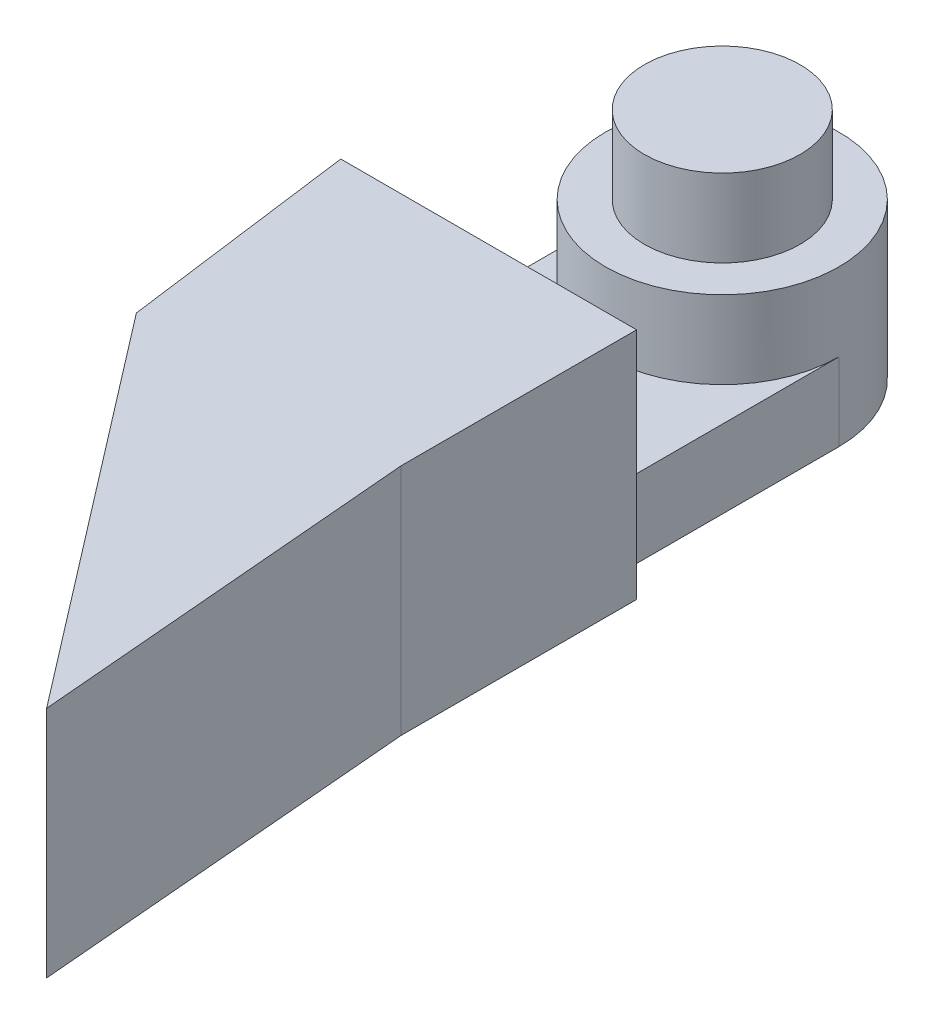
ISO-10303-21;
HEADER;
FILE_DESCRIPTION(('STEP AP214'),'2;1');
FILE_NAME('part.step','',(''),(''),'','','');
FILE_SCHEMA(('AUTOMOTIVE_DESIGN { 1 0 10303 214 1 1 1 1 }'));
ENDSEC;
DATA;
#1=APPLICATION_CONTEXT('core data for automotive mechanical design processes');
#2=APPLICATION_PROTOCOL_DEFINITION('international standard','automotive_design',2000,#1);
#3=PRODUCT_CONTEXT('',#1,'mechanical');
#4=PRODUCT('Part','Part','',(#3));
#5=PRODUCT_RELATED_PRODUCT_CATEGORY('part','',(#4));
#6=PRODUCT_DEFINITION_FORMATION('','',#4);
#7=PRODUCT_DEFINITION_CONTEXT('part definition',#1,'design');
#8=PRODUCT_DEFINITION('design','',#6,#7);
#9=PRODUCT_DEFINITION_SHAPE('','',#8);
#10=(LENGTH_UNIT() NAMED_UNIT(*) SI_UNIT(.MILLI.,.METRE.));
#11=(NAMED_UNIT(*) PLANE_ANGLE_UNIT() SI_UNIT($,.RADIAN.));
#12=(NAMED_UNIT(*) SI_UNIT($,.STERADIAN.) SOLID_ANGLE_UNIT());
#13=UNCERTAINTY_MEASURE_WITH_UNIT(LENGTH_MEASURE(1.E-05),#10,'distance_accuracy_value','');
#14=(GEOMETRIC_REPRESENTATION_CONTEXT(3) GLOBAL_UNCERTAINTY_ASSIGNED_CONTEXT((#13)) GLOBAL_UNIT_ASSIGNED_CONTEXT((#10,
#11,#12)) REPRESENTATION_CONTEXT('',''));
#15=CARTESIAN_POINT('',(0.,0.,0.));
#16=DIRECTION('',(0.,0.,1.));
#17=DIRECTION('',(1.,0.,0.));
#18=AXIS2_PLACEMENT_3D('',#15,#16,#17);
#19=CARTESIAN_POINT('',(0.,10.,0.));
#20=DIRECTION('',(0.,-1.,0.));
#21=DIRECTION('',(0.,0.,-1.));
#22=AXIS2_PLACEMENT_3D('',#19,#20,#21);
#23=CYLINDRICAL_SURFACE('',#22,7.5);
#24=CARTESIAN_POINT('',(0.,10.,0.));
#25=DIRECTION('',(0.,1.,0.));
#26=DIRECTION('',(0.,0.,1.));
#27=AXIS2_PLACEMENT_3D('',#24,#25,#26);
#28=CIRCLE('',#27,7.5);
#29=CARTESIAN_POINT('',(0.,10.,7.5));
#30=VERTEX_POINT('',#29);
#31=EDGE_CURVE('E11',#30,#30,#28,.T.);
#32=ORIENTED_EDGE('',*,*,#31,.F.);
#33=EDGE_LOOP('',(#32));
#34=FACE_BOUND('',#33,.T.);
#35=DIRECTION('',(0.,-1.,0.));
#36=VECTOR('',#35,1.);
#37=CARTESIAN_POINT('',(-7.5,5.,0.));
#38=LINE('',#37,#36);
#39=CARTESIAN_POINT('',(-7.5,5.,0.));
#40=VERTEX_POINT('',#39);
#41=CARTESIAN_POINT('',(-7.5,0.,0.));
#42=VERTEX_POINT('',#41);
#43=EDGE_CURVE('E55',#40,#42,#38,.T.);
#44=ORIENTED_EDGE('',*,*,#43,.F.);
#45=CARTESIAN_POINT('',(0.,5.,0.));
#46=DIRECTION('',(0.,1.,0.));
#47=DIRECTION('',(0.,0.,1.));
#48=AXIS2_PLACEMENT_3D('',#45,#46,#47);
#49=CIRCLE('',#48,7.5);
#50=CARTESIAN_POINT('',(7.5,5.,0.));
#51=VERTEX_POINT('',#50);
#52=EDGE_CURVE('E50',#40,#51,#49,.T.);
#53=ORIENTED_EDGE('',*,*,#52,.T.);
#54=DIRECTION('',(0.,-1.,0.));
#55=VECTOR('',#54,1.);
#56=CARTESIAN_POINT('',(7.5,5.,0.));
#57=LINE('',#56,#55);
#58=CARTESIAN_POINT('',(7.5,0.,0.));
#59=VERTEX_POINT('',#58);
#60=EDGE_CURVE('E149',#51,#59,#57,.T.);
#61=ORIENTED_EDGE('',*,*,#60,.T.);
#62=CARTESIAN_POINT('',(0.,0.,0.));
#63=DIRECTION('',(0.,1.,0.));
#64=DIRECTION('',(0.,0.,1.));
#65=AXIS2_PLACEMENT_3D('',#62,#63,#64);
#66=CIRCLE('',#65,7.5);
#67=EDGE_CURVE('E38',#59,#42,#66,.T.);
#68=ORIENTED_EDGE('',*,*,#67,.T.);
#69=EDGE_LOOP('',(#44,#53,#61,#68));
#70=FACE_BOUND('',#69,.T.);
#71=ADVANCED_FACE('F35',(#34,#70),#23,.T.);
#72=CARTESIAN_POINT('',(0.,10.,0.));
#73=DIRECTION('',(0.,1.,0.));
#74=DIRECTION('',(0.,0.,1.));
#75=AXIS2_PLACEMENT_3D('',#72,#73,#74);
#76=PLANE('',#75);
#77=CARTESIAN_POINT('',(0.,10.,0.));
#78=DIRECTION('',(0.,1.,0.));
#79=DIRECTION('',(0.,0.,1.));
#80=AXIS2_PLACEMENT_3D('',#77,#78,#79);
#81=CIRCLE('',#80,5.);
#82=CARTESIAN_POINT('',(0.,10.,5.));
#83=VERTEX_POINT('',#82);
#84=EDGE_CURVE('E43',#83,#83,#81,.T.);
#85=ORIENTED_EDGE('',*,*,#84,.F.);
#86=EDGE_LOOP('',(#85));
#87=FACE_BOUND('',#86,.T.);
#88=ORIENTED_EDGE('',*,*,#31,.T.);
#89=EDGE_LOOP('',(#88));
#90=FACE_BOUND('',#89,.T.);
#91=ADVANCED_FACE('F218',(#87,#90),#76,.T.);
#92=CARTESIAN_POINT('',(0.,0.,0.));
#93=DIRECTION('',(0.,1.,0.));
#94=DIRECTION('',(0.,0.,1.));
#95=AXIS2_PLACEMENT_3D('',#92,#93,#94);
#96=PLANE('',#95);
#97=ORIENTED_EDGE('',*,*,#67,.F.);
#98=DIRECTION('',(0.,0.,1.));
#99=VECTOR('',#98,1.);
#100=CARTESIAN_POINT('',(7.5,0.,0.));
#101=LINE('',#100,#99);
#102=CARTESIAN_POINT('',(7.5,0.,15.));
#103=VERTEX_POINT('',#102);
#104=EDGE_CURVE('E135',#59,#103,#101,.T.);
#105=ORIENTED_EDGE('',*,*,#104,.T.);
#106=DIRECTION('',(-1.,0.,0.));
#107=VECTOR('',#106,1.);
#108=CARTESIAN_POINT('',(0.,0.,15.));
#109=LINE('',#108,#107);
#110=CARTESIAN_POINT('',(9.49999999999999,0.,15.));
#111=VERTEX_POINT('',#110);
#112=EDGE_CURVE('E175',#111,#103,#109,.T.);
#113=ORIENTED_EDGE('',*,*,#112,.F.);
#114=DIRECTION('',(0.,0.,-1.));
#115=VECTOR('',#114,1.);
#116=CARTESIAN_POINT('',(9.49999999999999,0.,0.));
#117=LINE('',#116,#115);
#118=CARTESIAN_POINT('',(9.5,0.,30.1271585302061));
#119=VERTEX_POINT('',#118);
#120=EDGE_CURVE('E132',#119,#111,#117,.T.);
#121=ORIENTED_EDGE('',*,*,#120,.F.);
#122=DIRECTION('',(-0.0844230553486425,0.,-0.996430001417862));
#123=VECTOR('',#122,1.);
#124=CARTESIAN_POINT('',(6.89794436127043,0.,-0.584431959871487));
#125=LINE('',#124,#123);
#126=CARTESIAN_POINT('',(11.6073645605757,0.,55.));
#127=VERTEX_POINT('',#126);
#128=EDGE_CURVE('E128',#127,#119,#125,.T.);
#129=ORIENTED_EDGE('',*,*,#128,.F.);
#130=DIRECTION('',(0.609198044114665,0.,0.793018122773286));
#131=VECTOR('',#130,1.);
#132=CARTESIAN_POINT('',(-19.2711666861763,0.,14.8041472393722));
#133=LINE('',#132,#131);
#134=CARTESIAN_POINT('',(-7.5,0.,30.1271585302061));
#135=VERTEX_POINT('',#134);
#136=EDGE_CURVE('E182',#135,#127,#133,.T.);
#137=ORIENTED_EDGE('',*,*,#136,.F.);
#138=DIRECTION('',(0.131071920752449,0.,0.991372862040445));
#139=VECTOR('',#138,1.);
#140=CARTESIAN_POINT('',(-11.2859086182499,0.,1.49213860563623));
#141=LINE('',#140,#139);
#142=CARTESIAN_POINT('',(-9.50000000000001,0.,15.));
#143=VERTEX_POINT('',#142);
#144=EDGE_CURVE('E174',#143,#135,#141,.T.);
#145=ORIENTED_EDGE('',*,*,#144,.F.);
#146=CARTESIAN_POINT('',(-7.5,0.,15.));
#147=VERTEX_POINT('',#146);
#148=EDGE_CURVE('E172',#147,#143,#109,.T.);
#149=ORIENTED_EDGE('',*,*,#148,.F.);
#150=DIRECTION('',(0.,0.,1.));
#151=VECTOR('',#150,1.);
#152=CARTESIAN_POINT('',(-7.5,0.,0.));
#153=LINE('',#152,#151);
#154=EDGE_CURVE('E133',#42,#147,#153,.T.);
#155=ORIENTED_EDGE('',*,*,#154,.F.);
#156=EDGE_LOOP('',(#97,#105,#113,#121,#129,#137,#145,#149,#155));
#157=FACE_BOUND('',#156,.T.);
#158=ADVANCED_FACE('F170',(#157),#96,.F.);
#159=CARTESIAN_POINT('',(-7.5,5.,0.));
#160=DIRECTION('',(1.,0.,0.));
#161=DIRECTION('',(0.,0.,-1.));
#162=AXIS2_PLACEMENT_3D('',#159,#160,#161);
#163=PLANE('',#162);
#164=ORIENTED_EDGE('',*,*,#154,.T.);
#165=DIRECTION('',(0.,-1.,0.));
#166=VECTOR('',#165,1.);
#167=CARTESIAN_POINT('',(-7.5,5.,15.));
#168=LINE('',#167,#166);
#169=CARTESIAN_POINT('',(-7.5,5.,15.));
#170=VERTEX_POINT('',#169);
#171=EDGE_CURVE('E156',#170,#147,#168,.T.);
#172=ORIENTED_EDGE('',*,*,#171,.F.);
#173=DIRECTION('',(0.,0.,1.));
#174=VECTOR('',#173,1.);
#175=CARTESIAN_POINT('',(-7.5,5.,0.));
#176=LINE('',#175,#174);
#177=EDGE_CURVE('E142',#40,#170,#176,.T.);
#178=ORIENTED_EDGE('',*,*,#177,.F.);
#179=ORIENTED_EDGE('',*,*,#43,.T.);
#180=EDGE_LOOP('',(#164,#172,#178,#179));
#181=FACE_BOUND('',#180,.T.);
#182=ADVANCED_FACE('F167',(#181),#163,.F.);
#183=CARTESIAN_POINT('',(7.5,5.,0.));
#184=DIRECTION('',(1.,0.,0.));
#185=DIRECTION('',(0.,0.,-1.));
#186=AXIS2_PLACEMENT_3D('',#183,#184,#185);
#187=PLANE('',#186);
#188=ORIENTED_EDGE('',*,*,#104,.F.);
#189=ORIENTED_EDGE('',*,*,#60,.F.);
#190=DIRECTION('',(0.,0.,1.));
#191=VECTOR('',#190,1.);
#192=CARTESIAN_POINT('',(7.5,5.,0.));
#193=LINE('',#192,#191);
#194=CARTESIAN_POINT('',(7.5,5.,15.));
#195=VERTEX_POINT('',#194);
#196=EDGE_CURVE('E147',#51,#195,#193,.T.);
#197=ORIENTED_EDGE('',*,*,#196,.T.);
#198=DIRECTION('',(0.,-1.,0.));
#199=VECTOR('',#198,1.);
#200=CARTESIAN_POINT('',(7.5,5.,15.));
#201=LINE('',#200,#199);
#202=EDGE_CURVE('E154',#195,#103,#201,.T.);
#203=ORIENTED_EDGE('',*,*,#202,.T.);
#204=EDGE_LOOP('',(#188,#189,#197,#203));
#205=FACE_BOUND('',#204,.T.);
#206=ADVANCED_FACE('F233',(#205),#187,.T.);
#207=CARTESIAN_POINT('',(0.,5.,0.));
#208=DIRECTION('',(0.,1.,0.));
#209=DIRECTION('',(0.,0.,1.));
#210=AXIS2_PLACEMENT_3D('',#207,#208,#209);
#211=PLANE('',#210);
#212=ORIENTED_EDGE('',*,*,#52,.F.);
#213=ORIENTED_EDGE('',*,*,#177,.T.);
#214=DIRECTION('',(-1.,0.,0.));
#215=VECTOR('',#214,1.);
#216=CARTESIAN_POINT('',(0.,5.,15.));
#217=LINE('',#216,#215);
#218=EDGE_CURVE('E144',#195,#170,#217,.T.);
#219=ORIENTED_EDGE('',*,*,#218,.F.);
#220=ORIENTED_EDGE('',*,*,#196,.F.);
#221=EDGE_LOOP('',(#212,#213,#219,#220));
#222=FACE_BOUND('',#221,.T.);
#223=ADVANCED_FACE('F236',(#222),#211,.T.);
#224=CARTESIAN_POINT('',(9.49999999999999,15.,0.));
#225=DIRECTION('',(-1.,0.,0.));
#226=DIRECTION('',(0.,0.,1.));
#227=AXIS2_PLACEMENT_3D('',#224,#225,#226);
#228=PLANE('',#227);
#229=ORIENTED_EDGE('',*,*,#120,.T.);
#230=DIRECTION('',(0.,-1.,0.));
#231=VECTOR('',#230,1.);
#232=CARTESIAN_POINT('',(9.49999999999999,15.,15.));
#233=LINE('',#232,#231);
#234=CARTESIAN_POINT('',(9.49999999999999,15.,15.));
#235=VERTEX_POINT('',#234);
#236=EDGE_CURVE('E112',#235,#111,#233,.T.);
#237=ORIENTED_EDGE('',*,*,#236,.F.);
#238=DIRECTION('',(0.,0.,-1.));
#239=VECTOR('',#238,1.);
#240=CARTESIAN_POINT('',(9.49999999999999,15.,0.));
#241=LINE('',#240,#239);
#242=CARTESIAN_POINT('',(9.5,15.,30.1271585302061));
#243=VERTEX_POINT('',#242);
#244=EDGE_CURVE('E119',#243,#235,#241,.T.);
#245=ORIENTED_EDGE('',*,*,#244,.F.);
#246=DIRECTION('',(0.,-1.,0.));
#247=VECTOR('',#246,1.);
#248=CARTESIAN_POINT('',(9.5,15.,30.1271585302061));
#249=LINE('',#248,#247);
#250=EDGE_CURVE('E185',#243,#119,#249,.T.);
#251=ORIENTED_EDGE('',*,*,#250,.T.);
#252=EDGE_LOOP('',(#229,#237,#245,#251));
#253=FACE_BOUND('',#252,.T.);
#254=ADVANCED_FACE('F130',(#253),#228,.F.);
#255=CARTESIAN_POINT('',(0.,15.,15.));
#256=DIRECTION('',(0.,0.,1.));
#257=DIRECTION('',(1.,0.,0.));
#258=AXIS2_PLACEMENT_3D('',#255,#256,#257);
#259=PLANE('',#258);
#260=ORIENTED_EDGE('',*,*,#202,.F.);
#261=ORIENTED_EDGE('',*,*,#218,.T.);
#262=ORIENTED_EDGE('',*,*,#171,.T.);
#263=ORIENTED_EDGE('',*,*,#148,.T.);
#264=DIRECTION('',(0.,-1.,0.));
#265=VECTOR('',#264,1.);
#266=CARTESIAN_POINT('',(-9.50000000000001,15.,15.));
#267=LINE('',#266,#265);
#268=CARTESIAN_POINT('',(-9.50000000000001,15.,15.));
#269=VERTEX_POINT('',#268);
#270=EDGE_CURVE('E115',#269,#143,#267,.T.);
#271=ORIENTED_EDGE('',*,*,#270,.F.);
#272=DIRECTION('',(-1.,0.,0.));
#273=VECTOR('',#272,1.);
#274=CARTESIAN_POINT('',(0.,15.,15.));
#275=LINE('',#274,#273);
#276=EDGE_CURVE('E106',#235,#269,#275,.T.);
#277=ORIENTED_EDGE('',*,*,#276,.F.);
#278=ORIENTED_EDGE('',*,*,#236,.T.);
#279=ORIENTED_EDGE('',*,*,#112,.T.);
#280=EDGE_LOOP('',(#260,#261,#262,#263,#271,#277,#278,#279));
#281=FACE_BOUND('',#280,.T.);
#282=ADVANCED_FACE('F109',(#281),#259,.F.);
#283=CARTESIAN_POINT('',(-11.2859086182499,15.,1.49213860563623));
#284=DIRECTION('',(0.991372862040445,0.,-0.131071920752448));
#285=DIRECTION('',(-0.131071920752449,0.,-0.991372862040445));
#286=AXIS2_PLACEMENT_3D('',#283,#284,#285);
#287=PLANE('',#286);
#288=ORIENTED_EDGE('',*,*,#144,.T.);
#289=DIRECTION('',(0.,-1.,0.));
#290=VECTOR('',#289,1.);
#291=CARTESIAN_POINT('',(-7.5,15.,30.1271585302061));
#292=LINE('',#291,#290);
#293=CARTESIAN_POINT('',(-7.5,15.,30.1271585302061));
#294=VERTEX_POINT('',#293);
#295=EDGE_CURVE('E137',#294,#135,#292,.T.);
#296=ORIENTED_EDGE('',*,*,#295,.F.);
#297=DIRECTION('',(0.131071920752449,0.,0.991372862040445));
#298=VECTOR('',#297,1.);
#299=CARTESIAN_POINT('',(-11.2859086182499,15.,1.49213860563623));
#300=LINE('',#299,#298);
#301=EDGE_CURVE('E118',#269,#294,#300,.T.);
#302=ORIENTED_EDGE('',*,*,#301,.F.);
#303=ORIENTED_EDGE('',*,*,#270,.T.);
#304=EDGE_LOOP('',(#288,#296,#302,#303));
#305=FACE_BOUND('',#304,.T.);
#306=ADVANCED_FACE('F245',(#305),#287,.F.);
#307=CARTESIAN_POINT('',(-19.2711666861763,15.,14.8041472393722));
#308=DIRECTION('',(0.793018122773286,0.,-0.609198044114665));
#309=DIRECTION('',(-0.609198044114665,0.,-0.793018122773286));
#310=AXIS2_PLACEMENT_3D('',#307,#308,#309);
#311=PLANE('',#310);
#312=ORIENTED_EDGE('',*,*,#136,.T.);
#313=DIRECTION('',(0.,-1.,0.));
#314=VECTOR('',#313,1.);
#315=CARTESIAN_POINT('',(11.6073645605757,15.,55.));
#316=LINE('',#315,#314);
#317=CARTESIAN_POINT('',(11.6073645605757,15.,55.));
#318=VERTEX_POINT('',#317);
#319=EDGE_CURVE('E187',#318,#127,#316,.T.);
#320=ORIENTED_EDGE('',*,*,#319,.F.);
#321=DIRECTION('',(0.609198044114665,0.,0.793018122773286));
#322=VECTOR('',#321,1.);
#323=CARTESIAN_POINT('',(-19.2711666861763,15.,14.8041472393722));
#324=LINE('',#323,#322);
#325=EDGE_CURVE('E195',#294,#318,#324,.T.);
#326=ORIENTED_EDGE('',*,*,#325,.F.);
#327=ORIENTED_EDGE('',*,*,#295,.T.);
#328=EDGE_LOOP('',(#312,#320,#326,#327));
#329=FACE_BOUND('',#328,.T.);
#330=ADVANCED_FACE('F193',(#329),#311,.F.);
#331=CARTESIAN_POINT('',(6.89794436127043,15.,-0.584431959871487));
#332=DIRECTION('',(-0.996430001417862,0.,0.0844230553486425));
#333=DIRECTION('',(0.0844230553486425,0.,0.996430001417862));
#334=AXIS2_PLACEMENT_3D('',#331,#332,#333);
#335=PLANE('',#334);
#336=ORIENTED_EDGE('',*,*,#128,.T.);
#337=ORIENTED_EDGE('',*,*,#250,.F.);
#338=DIRECTION('',(-0.0844230553486425,0.,-0.996430001417862));
#339=VECTOR('',#338,1.);
#340=CARTESIAN_POINT('',(6.89794436127043,15.,-0.584431959871487));
#341=LINE('',#340,#339);
#342=EDGE_CURVE('E124',#318,#243,#341,.T.);
#343=ORIENTED_EDGE('',*,*,#342,.F.);
#344=ORIENTED_EDGE('',*,*,#319,.T.);
#345=EDGE_LOOP('',(#336,#337,#343,#344));
#346=FACE_BOUND('',#345,.T.);
#347=ADVANCED_FACE('F199',(#346),#335,.F.);
#348=CARTESIAN_POINT('',(0.,15.,0.));
#349=DIRECTION('',(0.,1.,0.));
#350=DIRECTION('',(0.,0.,1.));
#351=AXIS2_PLACEMENT_3D('',#348,#349,#350);
#352=PLANE('',#351);
#353=ORIENTED_EDGE('',*,*,#244,.T.);
#354=ORIENTED_EDGE('',*,*,#276,.T.);
#355=ORIENTED_EDGE('',*,*,#301,.T.);
#356=ORIENTED_EDGE('',*,*,#325,.T.);
#357=ORIENTED_EDGE('',*,*,#342,.T.);
#358=EDGE_LOOP('',(#353,#354,#355,#356,#357));
#359=FACE_BOUND('',#358,.T.);
#360=ADVANCED_FACE('F122',(#359),#352,.T.);
#361=CARTESIAN_POINT('',(0.,15.,0.));
#362=DIRECTION('',(0.,-1.,0.));
#363=DIRECTION('',(0.,0.,-1.));
#364=AXIS2_PLACEMENT_3D('',#361,#362,#363);
#365=CYLINDRICAL_SURFACE('',#364,5.);
#366=ORIENTED_EDGE('',*,*,#84,.T.);
#367=EDGE_LOOP('',(#366));
#368=FACE_BOUND('',#367,.T.);
#369=CARTESIAN_POINT('',(0.,15.,0.));
#370=DIRECTION('',(0.,1.,0.));
#371=DIRECTION('',(0.,0.,1.));
#372=AXIS2_PLACEMENT_3D('',#369,#370,#371);
#373=CIRCLE('',#372,5.);
#374=CARTESIAN_POINT('',(0.,15.,5.));
#375=VERTEX_POINT('',#374);
#376=EDGE_CURVE('E177',#375,#375,#373,.T.);
#377=ORIENTED_EDGE('',*,*,#376,.F.);
#378=EDGE_LOOP('',(#377));
#379=FACE_BOUND('',#378,.T.);
#380=ADVANCED_FACE('F208',(#368,#379),#365,.T.);
#381=CARTESIAN_POINT('',(0.,15.,0.));
#382=DIRECTION('',(0.,1.,0.));
#383=DIRECTION('',(0.,0.,1.));
#384=AXIS2_PLACEMENT_3D('',#381,#382,#383);
#385=PLANE('',#384);
#386=ORIENTED_EDGE('',*,*,#376,.T.);
#387=EDGE_LOOP('',(#386));
#388=FACE_BOUND('',#387,.T.);
#389=ADVANCED_FACE('F206',(#388),#385,.T.);
#390=CLOSED_SHELL('',(#71,#91,#158,#182,#206,#223,#254,#282,#306,#330,#347,#360,#380,#389));
#391=MANIFOLD_SOLID_BREP('B2',#390);
#392=ADVANCED_BREP_SHAPE_REPRESENTATION('',(#18,#391),#14);
#393=SHAPE_DEFINITION_REPRESENTATION(#9,#392);
ENDSEC;
END-ISO-10303-21;
